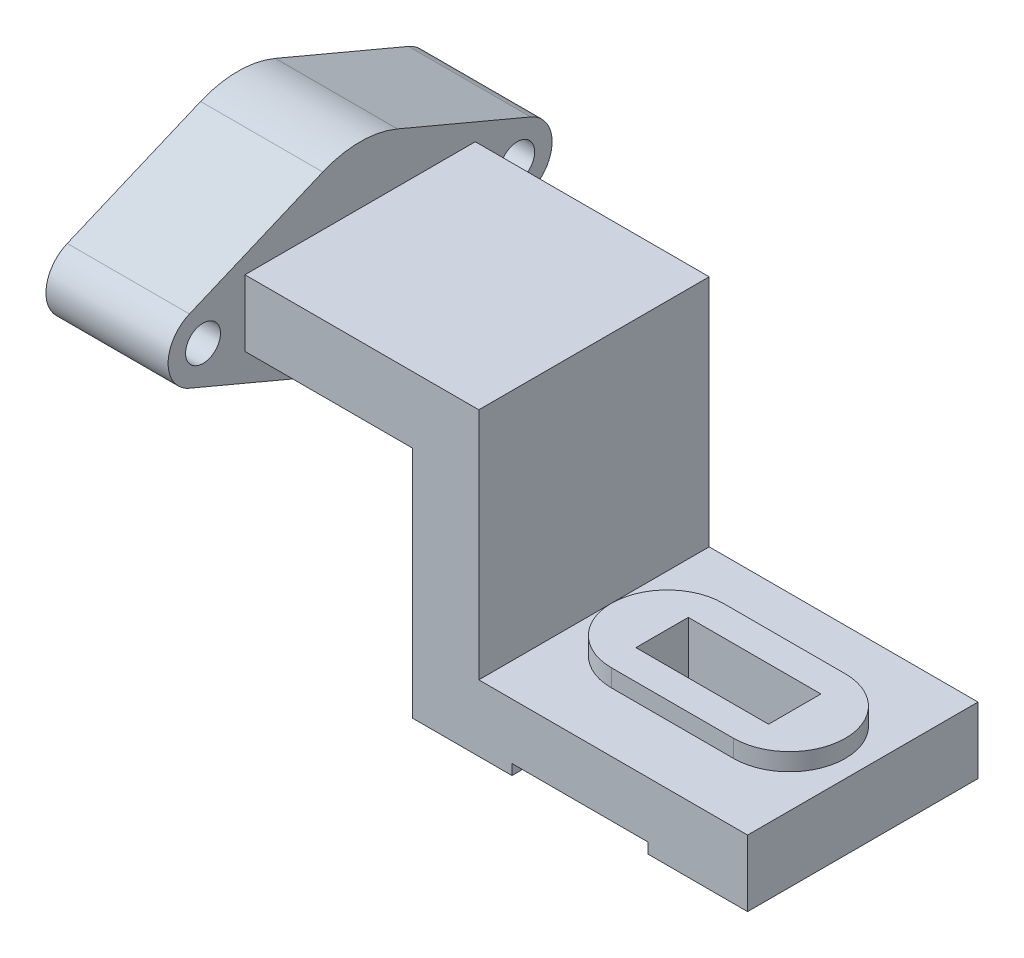
ISO-10303-21;
HEADER;
FILE_DESCRIPTION(('STEP AP214'),'2;1');
FILE_NAME('part.step','',(''),(''),'','','');
FILE_SCHEMA(('AUTOMOTIVE_DESIGN { 1 0 10303 214 1 1 1 1 }'));
ENDSEC;
DATA;
#1=APPLICATION_CONTEXT('core data for automotive mechanical design processes');
#2=APPLICATION_PROTOCOL_DEFINITION('international standard','automotive_design',2000,#1);
#3=PRODUCT_CONTEXT('',#1,'mechanical');
#4=PRODUCT('Part','Part','',(#3));
#5=PRODUCT_RELATED_PRODUCT_CATEGORY('part','',(#4));
#6=PRODUCT_DEFINITION_FORMATION('','',#4);
#7=PRODUCT_DEFINITION_CONTEXT('part definition',#1,'design');
#8=PRODUCT_DEFINITION('design','',#6,#7);
#9=PRODUCT_DEFINITION_SHAPE('','',#8);
#10=(LENGTH_UNIT() NAMED_UNIT(*) SI_UNIT(.MILLI.,.METRE.));
#11=(NAMED_UNIT(*) PLANE_ANGLE_UNIT() SI_UNIT($,.RADIAN.));
#12=(NAMED_UNIT(*) SI_UNIT($,.STERADIAN.) SOLID_ANGLE_UNIT());
#13=UNCERTAINTY_MEASURE_WITH_UNIT(LENGTH_MEASURE(1.E-05),#10,'distance_accuracy_value','');
#14=(GEOMETRIC_REPRESENTATION_CONTEXT(3) GLOBAL_UNCERTAINTY_ASSIGNED_CONTEXT((#13)) GLOBAL_UNIT_ASSIGNED_CONTEXT((#10,
#11,#12)) REPRESENTATION_CONTEXT('',''));
#15=CARTESIAN_POINT('',(0.,0.,0.));
#16=DIRECTION('',(0.,0.,1.));
#17=DIRECTION('',(1.,0.,0.));
#18=AXIS2_PLACEMENT_3D('',#15,#16,#17);
#19=CARTESIAN_POINT('',(19.5,3.00000000000001,33.));
#20=DIRECTION('',(1.,0.,0.));
#21=DIRECTION('',(0.,1.,0.));
#22=AXIS2_PLACEMENT_3D('',#19,#20,#21);
#23=PLANE('',#22);
#24=DIRECTION('',(0.,0.,-1.));
#25=VECTOR('',#24,1.);
#26=CARTESIAN_POINT('',(19.5,3.00000000000001,33.));
#27=LINE('',#26,#25);
#28=CARTESIAN_POINT('',(19.5,3.00000000000001,33.));
#29=VERTEX_POINT('',#28);
#30=CARTESIAN_POINT('',(19.5,3.00000000000001,7.50000000000001));
#31=VERTEX_POINT('',#30);
#32=EDGE_CURVE('E482',#29,#31,#27,.T.);
#33=ORIENTED_EDGE('',*,*,#32,.T.);
#34=DIRECTION('',(0.,-1.,0.));
#35=VECTOR('',#34,1.);
#36=CARTESIAN_POINT('',(19.5,3.00000000000001,7.50000000000001));
#37=LINE('',#36,#35);
#38=CARTESIAN_POINT('',(19.5,0.,7.50000000000001));
#39=VERTEX_POINT('',#38);
#40=EDGE_CURVE('E326',#31,#39,#37,.T.);
#41=ORIENTED_EDGE('',*,*,#40,.T.);
#42=DIRECTION('',(0.,0.,-1.));
#43=VECTOR('',#42,1.);
#44=CARTESIAN_POINT('',(19.5,0.,33.));
#45=LINE('',#44,#43);
#46=CARTESIAN_POINT('',(19.5,0.,33.));
#47=VERTEX_POINT('',#46);
#48=EDGE_CURVE('E477',#47,#39,#45,.T.);
#49=ORIENTED_EDGE('',*,*,#48,.F.);
#50=DIRECTION('',(0.,-1.,0.));
#51=VECTOR('',#50,1.);
#52=CARTESIAN_POINT('',(19.5,3.00000000000001,33.));
#53=LINE('',#52,#51);
#54=EDGE_CURVE('E400',#29,#47,#53,.T.);
#55=ORIENTED_EDGE('',*,*,#54,.F.);
#56=EDGE_LOOP('',(#33,#41,#49,#55));
#57=FACE_BOUND('',#56,.T.);
#58=ADVANCED_FACE('F45',(#57),#23,.F.);
#59=CARTESIAN_POINT('',(-29.,19.,33.));
#60=DIRECTION('',(0.,-1.,0.));
#61=DIRECTION('',(0.,0.,-1.));
#62=AXIS2_PLACEMENT_3D('',#59,#60,#61);
#63=PLANE('',#62);
#64=DIRECTION('',(-1.,0.,0.));
#65=VECTOR('',#64,1.);
#66=CARTESIAN_POINT('',(-29.,19.,-33.));
#67=LINE('',#66,#65);
#68=CARTESIAN_POINT('',(48.,19.,-33.));
#69=VERTEX_POINT('',#68);
#70=CARTESIAN_POINT('',(-29.,19.,-33.));
#71=VERTEX_POINT('',#70);
#72=EDGE_CURVE('E448',#69,#71,#67,.T.);
#73=ORIENTED_EDGE('',*,*,#72,.T.);
#74=DIRECTION('',(0.,0.,-1.));
#75=VECTOR('',#74,1.);
#76=CARTESIAN_POINT('',(-29.,19.,33.));
#77=LINE('',#76,#75);
#78=CARTESIAN_POINT('',(-29.,19.,33.));
#79=VERTEX_POINT('',#78);
#80=EDGE_CURVE('E464',#79,#71,#77,.T.);
#81=ORIENTED_EDGE('',*,*,#80,.F.);
#82=DIRECTION('',(-1.,0.,0.));
#83=VECTOR('',#82,1.);
#84=CARTESIAN_POINT('',(-29.,19.,33.));
#85=LINE('',#84,#83);
#86=CARTESIAN_POINT('',(48.,19.,33.));
#87=VERTEX_POINT('',#86);
#88=EDGE_CURVE('E409',#87,#79,#85,.T.);
#89=ORIENTED_EDGE('',*,*,#88,.F.);
#90=DIRECTION('',(0.,0.,-1.));
#91=VECTOR('',#90,1.);
#92=CARTESIAN_POINT('',(48.,19.,33.));
#93=LINE('',#92,#91);
#94=EDGE_CURVE('E468',#87,#69,#93,.T.);
#95=ORIENTED_EDGE('',*,*,#94,.T.);
#96=EDGE_LOOP('',(#73,#81,#89,#95));
#97=FACE_BOUND('',#96,.T.);
#98=CARTESIAN_POINT('',(-7.99999999999999,19.,0.));
#99=DIRECTION('',(0.,1.,0.));
#100=DIRECTION('',(0.,0.,1.));
#101=AXIS2_PLACEMENT_3D('',#98,#99,#100);
#102=CIRCLE('',#101,16.);
#103=CARTESIAN_POINT('',(-8.00000000000001,19.,-16.));
#104=VERTEX_POINT('',#103);
#105=CARTESIAN_POINT('',(-8.,19.,16.));
#106=VERTEX_POINT('',#105);
#107=EDGE_CURVE('E334',#104,#106,#102,.T.);
#108=ORIENTED_EDGE('',*,*,#107,.F.);
#109=DIRECTION('',(-1.,0.,0.));
#110=VECTOR('',#109,1.);
#111=CARTESIAN_POINT('',(-8.00000000000001,19.,-16.));
#112=LINE('',#111,#110);
#113=CARTESIAN_POINT('',(27.,19.,-16.));
#114=VERTEX_POINT('',#113);
#115=EDGE_CURVE('E340',#114,#104,#112,.T.);
#116=ORIENTED_EDGE('',*,*,#115,.F.);
#117=CARTESIAN_POINT('',(27.,19.,0.));
#118=DIRECTION('',(0.,1.,0.));
#119=DIRECTION('',(0.,0.,1.));
#120=AXIS2_PLACEMENT_3D('',#117,#118,#119);
#121=CIRCLE('',#120,16.);
#122=CARTESIAN_POINT('',(27.,19.,16.));
#123=VERTEX_POINT('',#122);
#124=EDGE_CURVE('E357',#123,#114,#121,.T.);
#125=ORIENTED_EDGE('',*,*,#124,.F.);
#126=DIRECTION('',(1.,0.,0.));
#127=VECTOR('',#126,1.);
#128=CARTESIAN_POINT('',(-8.,19.,16.));
#129=LINE('',#128,#127);
#130=EDGE_CURVE('E353',#106,#123,#129,.T.);
#131=ORIENTED_EDGE('',*,*,#130,.F.);
#132=EDGE_LOOP('',(#108,#116,#125,#131));
#133=FACE_BOUND('',#132,.T.);
#134=ADVANCED_FACE('F542',(#97,#133),#63,.F.);
#135=CARTESIAN_POINT('',(-48.,67.,33.));
#136=DIRECTION('',(0.,1.,0.));
#137=DIRECTION('',(0.,0.,1.));
#138=AXIS2_PLACEMENT_3D('',#135,#136,#137);
#139=PLANE('',#138);
#140=DIRECTION('',(1.,0.,0.));
#141=VECTOR('',#140,1.);
#142=CARTESIAN_POINT('',(-48.,67.,-33.));
#143=LINE('',#142,#141);
#144=CARTESIAN_POINT('',(-96.,67.,-33.));
#145=VERTEX_POINT('',#144);
#146=CARTESIAN_POINT('',(-48.,67.,-33.));
#147=VERTEX_POINT('',#146);
#148=EDGE_CURVE('E422',#145,#147,#143,.T.);
#149=ORIENTED_EDGE('',*,*,#148,.T.);
#150=DIRECTION('',(0.,0.,-1.));
#151=VECTOR('',#150,1.);
#152=CARTESIAN_POINT('',(-48.,67.,33.));
#153=LINE('',#152,#151);
#154=CARTESIAN_POINT('',(-48.,67.,33.));
#155=VERTEX_POINT('',#154);
#156=EDGE_CURVE('E54',#155,#147,#153,.T.);
#157=ORIENTED_EDGE('',*,*,#156,.F.);
#158=DIRECTION('',(1.,0.,0.));
#159=VECTOR('',#158,1.);
#160=CARTESIAN_POINT('',(-48.,67.,33.));
#161=LINE('',#160,#159);
#162=CARTESIAN_POINT('',(-96.,67.,33.));
#163=VERTEX_POINT('',#162);
#164=EDGE_CURVE('E384',#163,#155,#161,.T.);
#165=ORIENTED_EDGE('',*,*,#164,.F.);
#166=DIRECTION('',(0.,0.,-1.));
#167=VECTOR('',#166,1.);
#168=CARTESIAN_POINT('',(-96.,67.,33.));
#169=LINE('',#168,#167);
#170=EDGE_CURVE('E11',#163,#145,#169,.T.);
#171=ORIENTED_EDGE('',*,*,#170,.T.);
#172=EDGE_LOOP('',(#149,#157,#165,#171));
#173=FACE_BOUND('',#172,.T.);
#174=ADVANCED_FACE('F47',(#173),#139,.F.);
#175=CARTESIAN_POINT('',(-48.,0.,33.));
#176=DIRECTION('',(1.,0.,0.));
#177=DIRECTION('',(0.,0.,-1.));
#178=AXIS2_PLACEMENT_3D('',#175,#176,#177);
#179=PLANE('',#178);
#180=DIRECTION('',(0.,-1.,0.));
#181=VECTOR('',#180,1.);
#182=CARTESIAN_POINT('',(-48.,0.,-33.));
#183=LINE('',#182,#181);
#184=CARTESIAN_POINT('',(-48.,0.,-33.));
#185=VERTEX_POINT('',#184);
#186=EDGE_CURVE('E425',#147,#185,#183,.T.);
#187=ORIENTED_EDGE('',*,*,#186,.T.);
#188=DIRECTION('',(0.,0.,-1.));
#189=VECTOR('',#188,1.);
#190=CARTESIAN_POINT('',(-48.,0.,33.));
#191=LINE('',#190,#189);
#192=CARTESIAN_POINT('',(-48.,0.,33.));
#193=VERTEX_POINT('',#192);
#194=EDGE_CURVE('E494',#193,#185,#191,.T.);
#195=ORIENTED_EDGE('',*,*,#194,.F.);
#196=DIRECTION('',(0.,-1.,0.));
#197=VECTOR('',#196,1.);
#198=CARTESIAN_POINT('',(-48.,0.,33.));
#199=LINE('',#198,#197);
#200=EDGE_CURVE('E388',#155,#193,#199,.T.);
#201=ORIENTED_EDGE('',*,*,#200,.F.);
#202=ORIENTED_EDGE('',*,*,#156,.T.);
#203=EDGE_LOOP('',(#187,#195,#201,#202));
#204=FACE_BOUND('',#203,.T.);
#205=ADVANCED_FACE('F503',(#204),#179,.F.);
#206=CARTESIAN_POINT('',(-19.5,0.,33.));
#207=DIRECTION('',(0.,1.,0.));
#208=DIRECTION('',(-1.,0.,0.));
#209=AXIS2_PLACEMENT_3D('',#206,#207,#208);
#210=PLANE('',#209);
#211=DIRECTION('',(1.,0.,0.));
#212=VECTOR('',#211,1.);
#213=CARTESIAN_POINT('',(-19.5,0.,-33.));
#214=LINE('',#213,#212);
#215=CARTESIAN_POINT('',(-19.5,0.,-33.));
#216=VERTEX_POINT('',#215);
#217=EDGE_CURVE('E428',#185,#216,#214,.T.);
#218=ORIENTED_EDGE('',*,*,#217,.T.);
#219=DIRECTION('',(0.,0.,-1.));
#220=VECTOR('',#219,1.);
#221=CARTESIAN_POINT('',(-19.5,0.,33.));
#222=LINE('',#221,#220);
#223=CARTESIAN_POINT('',(-19.5,0.,33.));
#224=VERTEX_POINT('',#223);
#225=EDGE_CURVE('E490',#224,#216,#222,.T.);
#226=ORIENTED_EDGE('',*,*,#225,.F.);
#227=DIRECTION('',(1.,0.,0.));
#228=VECTOR('',#227,1.);
#229=CARTESIAN_POINT('',(-19.5,0.,33.));
#230=LINE('',#229,#228);
#231=EDGE_CURVE('E391',#193,#224,#230,.T.);
#232=ORIENTED_EDGE('',*,*,#231,.F.);
#233=ORIENTED_EDGE('',*,*,#194,.T.);
#234=EDGE_LOOP('',(#218,#226,#232,#233));
#235=FACE_BOUND('',#234,.T.);
#236=ADVANCED_FACE('F513',(#235),#210,.F.);
#237=CARTESIAN_POINT('',(-19.5,0.,33.));
#238=DIRECTION('',(-1.,0.,0.));
#239=DIRECTION('',(0.,-1.,0.));
#240=AXIS2_PLACEMENT_3D('',#237,#238,#239);
#241=PLANE('',#240);
#242=DIRECTION('',(0.,1.,0.));
#243=VECTOR('',#242,1.);
#244=CARTESIAN_POINT('',(-19.5,0.,-33.));
#245=LINE('',#244,#243);
#246=CARTESIAN_POINT('',(-19.5,3.,-33.));
#247=VERTEX_POINT('',#246);
#248=EDGE_CURVE('E431',#216,#247,#245,.T.);
#249=ORIENTED_EDGE('',*,*,#248,.T.);
#250=DIRECTION('',(0.,0.,-1.));
#251=VECTOR('',#250,1.);
#252=CARTESIAN_POINT('',(-19.5,3.,33.));
#253=LINE('',#252,#251);
#254=CARTESIAN_POINT('',(-19.5,3.,33.));
#255=VERTEX_POINT('',#254);
#256=EDGE_CURVE('E486',#255,#247,#253,.T.);
#257=ORIENTED_EDGE('',*,*,#256,.F.);
#258=DIRECTION('',(0.,1.,0.));
#259=VECTOR('',#258,1.);
#260=CARTESIAN_POINT('',(-19.5,0.,33.));
#261=LINE('',#260,#259);
#262=EDGE_CURVE('E394',#224,#255,#261,.T.);
#263=ORIENTED_EDGE('',*,*,#262,.F.);
#264=ORIENTED_EDGE('',*,*,#225,.T.);
#265=EDGE_LOOP('',(#249,#257,#263,#264));
#266=FACE_BOUND('',#265,.T.);
#267=ADVANCED_FACE('F517',(#266),#241,.F.);
#268=CARTESIAN_POINT('',(-19.5,3.,33.));
#269=DIRECTION('',(0.,1.,0.));
#270=DIRECTION('',(-1.,0.,0.));
#271=AXIS2_PLACEMENT_3D('',#268,#269,#270);
#272=PLANE('',#271);
#273=DIRECTION('',(0.,0.,1.));
#274=VECTOR('',#273,1.);
#275=CARTESIAN_POINT('',(-9.49999999999999,3.,33.));
#276=LINE('',#275,#274);
#277=CARTESIAN_POINT('',(-9.5,3.,-7.49999999999999));
#278=VERTEX_POINT('',#277);
#279=CARTESIAN_POINT('',(-9.49999999999999,3.,7.50000000000001));
#280=VERTEX_POINT('',#279);
#281=EDGE_CURVE('E322',#278,#280,#276,.T.);
#282=ORIENTED_EDGE('',*,*,#281,.T.);
#283=DIRECTION('',(1.,0.,0.));
#284=VECTOR('',#283,1.);
#285=CARTESIAN_POINT('',(-19.5,3.,7.50000000000001));
#286=LINE('',#285,#284);
#287=EDGE_CURVE('E330',#280,#31,#286,.T.);
#288=ORIENTED_EDGE('',*,*,#287,.T.);
#289=ORIENTED_EDGE('',*,*,#32,.F.);
#290=DIRECTION('',(1.,0.,0.));
#291=VECTOR('',#290,1.);
#292=CARTESIAN_POINT('',(-19.5,3.,33.));
#293=LINE('',#292,#291);
#294=EDGE_CURVE('E397',#255,#29,#293,.T.);
#295=ORIENTED_EDGE('',*,*,#294,.F.);
#296=ORIENTED_EDGE('',*,*,#256,.T.);
#297=DIRECTION('',(1.,0.,0.));
#298=VECTOR('',#297,1.);
#299=CARTESIAN_POINT('',(-19.5,3.,-33.));
#300=LINE('',#299,#298);
#301=CARTESIAN_POINT('',(19.5,3.00000000000001,-33.));
#302=VERTEX_POINT('',#301);
#303=EDGE_CURVE('E434',#247,#302,#300,.T.);
#304=ORIENTED_EDGE('',*,*,#303,.T.);
#305=CARTESIAN_POINT('',(19.5,3.00000000000001,-7.49999999999999));
#306=VERTEX_POINT('',#305);
#307=EDGE_CURVE('E481',#306,#302,#27,.T.);
#308=ORIENTED_EDGE('',*,*,#307,.F.);
#309=DIRECTION('',(-1.,0.,0.));
#310=VECTOR('',#309,1.);
#311=CARTESIAN_POINT('',(-19.5,3.,-7.49999999999999));
#312=LINE('',#311,#310);
#313=EDGE_CURVE('E318',#306,#278,#312,.T.);
#314=ORIENTED_EDGE('',*,*,#313,.T.);
#315=EDGE_LOOP('',(#282,#288,#289,#295,#296,#304,#308,#314));
#316=FACE_BOUND('',#315,.T.);
#317=ADVANCED_FACE('F560',(#316),#272,.F.);
#318=CARTESIAN_POINT('',(19.5,0.,-7.49999999999999));
#319=VERTEX_POINT('',#318);
#320=CARTESIAN_POINT('',(19.5,0.,-33.));
#321=VERTEX_POINT('',#320);
#322=EDGE_CURVE('E476',#319,#321,#45,.T.);
#323=ORIENTED_EDGE('',*,*,#322,.F.);
#324=DIRECTION('',(0.,1.,0.));
#325=VECTOR('',#324,1.);
#326=CARTESIAN_POINT('',(19.5,3.00000000000001,-7.49999999999999));
#327=LINE('',#326,#325);
#328=EDGE_CURVE('E61',#319,#306,#327,.T.);
#329=ORIENTED_EDGE('',*,*,#328,.T.);
#330=ORIENTED_EDGE('',*,*,#307,.T.);
#331=DIRECTION('',(0.,-1.,0.));
#332=VECTOR('',#331,1.);
#333=CARTESIAN_POINT('',(19.5,3.00000000000001,-33.));
#334=LINE('',#333,#332);
#335=EDGE_CURVE('E438',#302,#321,#334,.T.);
#336=ORIENTED_EDGE('',*,*,#335,.T.);
#337=EDGE_LOOP('',(#323,#329,#330,#336));
#338=FACE_BOUND('',#337,.T.);
#339=ADVANCED_FACE('F556',(#338),#23,.F.);
#340=CARTESIAN_POINT('',(48.,0.,33.));
#341=DIRECTION('',(0.,1.,0.));
#342=DIRECTION('',(-1.,0.,0.));
#343=AXIS2_PLACEMENT_3D('',#340,#341,#342);
#344=PLANE('',#343);
#345=ORIENTED_EDGE('',*,*,#48,.T.);
#346=DIRECTION('',(1.,0.,0.));
#347=VECTOR('',#346,1.);
#348=CARTESIAN_POINT('',(-9.49999999999999,0.,7.50000000000001));
#349=LINE('',#348,#347);
#350=CARTESIAN_POINT('',(28.5,0.,7.50000000000001));
#351=VERTEX_POINT('',#350);
#352=EDGE_CURVE('E290',#39,#351,#349,.T.);
#353=ORIENTED_EDGE('',*,*,#352,.T.);
#354=DIRECTION('',(0.,0.,-1.));
#355=VECTOR('',#354,1.);
#356=CARTESIAN_POINT('',(28.5,0.,-7.49999999999999));
#357=LINE('',#356,#355);
#358=CARTESIAN_POINT('',(28.5,0.,-7.49999999999999));
#359=VERTEX_POINT('',#358);
#360=EDGE_CURVE('E282',#351,#359,#357,.T.);
#361=ORIENTED_EDGE('',*,*,#360,.T.);
#362=DIRECTION('',(-1.,0.,0.));
#363=VECTOR('',#362,1.);
#364=CARTESIAN_POINT('',(-9.5,0.,-7.49999999999999));
#365=LINE('',#364,#363);
#366=EDGE_CURVE('E286',#359,#319,#365,.T.);
#367=ORIENTED_EDGE('',*,*,#366,.T.);
#368=ORIENTED_EDGE('',*,*,#322,.T.);
#369=DIRECTION('',(1.,0.,0.));
#370=VECTOR('',#369,1.);
#371=CARTESIAN_POINT('',(48.,0.,-33.));
#372=LINE('',#371,#370);
#373=CARTESIAN_POINT('',(48.,0.,-33.));
#374=VERTEX_POINT('',#373);
#375=EDGE_CURVE('E442',#321,#374,#372,.T.);
#376=ORIENTED_EDGE('',*,*,#375,.T.);
#377=DIRECTION('',(0.,0.,-1.));
#378=VECTOR('',#377,1.);
#379=CARTESIAN_POINT('',(48.,0.,33.));
#380=LINE('',#379,#378);
#381=CARTESIAN_POINT('',(48.,0.,33.));
#382=VERTEX_POINT('',#381);
#383=EDGE_CURVE('E472',#382,#374,#380,.T.);
#384=ORIENTED_EDGE('',*,*,#383,.F.);
#385=DIRECTION('',(1.,0.,0.));
#386=VECTOR('',#385,1.);
#387=CARTESIAN_POINT('',(48.,0.,33.));
#388=LINE('',#387,#386);
#389=EDGE_CURVE('E403',#47,#382,#388,.T.);
#390=ORIENTED_EDGE('',*,*,#389,.F.);
#391=EDGE_LOOP('',(#345,#353,#361,#367,#368,#376,#384,#390));
#392=FACE_BOUND('',#391,.T.);
#393=ADVANCED_FACE('F552',(#392),#344,.F.);
#394=CARTESIAN_POINT('',(48.,19.,33.));
#395=DIRECTION('',(-1.,0.,0.));
#396=DIRECTION('',(0.,0.,1.));
#397=AXIS2_PLACEMENT_3D('',#394,#395,#396);
#398=PLANE('',#397);
#399=DIRECTION('',(0.,1.,0.));
#400=VECTOR('',#399,1.);
#401=CARTESIAN_POINT('',(48.,19.,-33.));
#402=LINE('',#401,#400);
#403=EDGE_CURVE('E445',#374,#69,#402,.T.);
#404=ORIENTED_EDGE('',*,*,#403,.T.);
#405=ORIENTED_EDGE('',*,*,#94,.F.);
#406=DIRECTION('',(0.,1.,0.));
#407=VECTOR('',#406,1.);
#408=CARTESIAN_POINT('',(48.,19.,33.));
#409=LINE('',#408,#407);
#410=EDGE_CURVE('E406',#382,#87,#409,.T.);
#411=ORIENTED_EDGE('',*,*,#410,.F.);
#412=ORIENTED_EDGE('',*,*,#383,.T.);
#413=EDGE_LOOP('',(#404,#405,#411,#412));
#414=FACE_BOUND('',#413,.T.);
#415=ADVANCED_FACE('F548',(#414),#398,.F.);
#416=CARTESIAN_POINT('',(-29.,86.,33.));
#417=DIRECTION('',(-1.,0.,0.));
#418=DIRECTION('',(0.,-1.,0.));
#419=AXIS2_PLACEMENT_3D('',#416,#417,#418);
#420=PLANE('',#419);
#421=DIRECTION('',(0.,1.,0.));
#422=VECTOR('',#421,1.);
#423=CARTESIAN_POINT('',(-29.,86.,-33.));
#424=LINE('',#423,#422);
#425=CARTESIAN_POINT('',(-29.,86.,-33.));
#426=VERTEX_POINT('',#425);
#427=EDGE_CURVE('E451',#71,#426,#424,.T.);
#428=ORIENTED_EDGE('',*,*,#427,.T.);
#429=DIRECTION('',(0.,0.,-1.));
#430=VECTOR('',#429,1.);
#431=CARTESIAN_POINT('',(-29.,86.,33.));
#432=LINE('',#431,#430);
#433=CARTESIAN_POINT('',(-29.,86.,33.));
#434=VERTEX_POINT('',#433);
#435=EDGE_CURVE('E460',#434,#426,#432,.T.);
#436=ORIENTED_EDGE('',*,*,#435,.F.);
#437=DIRECTION('',(0.,1.,0.));
#438=VECTOR('',#437,1.);
#439=CARTESIAN_POINT('',(-29.,86.,33.));
#440=LINE('',#439,#438);
#441=EDGE_CURVE('E412',#79,#434,#440,.T.);
#442=ORIENTED_EDGE('',*,*,#441,.F.);
#443=ORIENTED_EDGE('',*,*,#80,.T.);
#444=EDGE_LOOP('',(#428,#436,#442,#443));
#445=FACE_BOUND('',#444,.T.);
#446=ADVANCED_FACE('F536',(#445),#420,.F.);
#447=CARTESIAN_POINT('',(-96.,86.,33.));
#448=DIRECTION('',(0.,-1.,0.));
#449=DIRECTION('',(0.,0.,-1.));
#450=AXIS2_PLACEMENT_3D('',#447,#448,#449);
#451=PLANE('',#450);
#452=DIRECTION('',(-1.,0.,0.));
#453=VECTOR('',#452,1.);
#454=CARTESIAN_POINT('',(-96.,86.,-33.));
#455=LINE('',#454,#453);
#456=CARTESIAN_POINT('',(-96.,86.,-33.));
#457=VERTEX_POINT('',#456);
#458=EDGE_CURVE('E385',#426,#457,#455,.T.);
#459=ORIENTED_EDGE('',*,*,#458,.T.);
#460=DIRECTION('',(0.,0.,-1.));
#461=VECTOR('',#460,1.);
#462=CARTESIAN_POINT('',(-96.,86.,33.));
#463=LINE('',#462,#461);
#464=CARTESIAN_POINT('',(-96.,86.,33.));
#465=VERTEX_POINT('',#464);
#466=EDGE_CURVE('E418',#465,#457,#463,.T.);
#467=ORIENTED_EDGE('',*,*,#466,.F.);
#468=DIRECTION('',(-1.,0.,0.));
#469=VECTOR('',#468,1.);
#470=CARTESIAN_POINT('',(-96.,86.,33.));
#471=LINE('',#470,#469);
#472=EDGE_CURVE('E415',#434,#465,#471,.T.);
#473=ORIENTED_EDGE('',*,*,#472,.F.);
#474=ORIENTED_EDGE('',*,*,#435,.T.);
#475=EDGE_LOOP('',(#459,#467,#473,#474));
#476=FACE_BOUND('',#475,.T.);
#477=ADVANCED_FACE('F531',(#476),#451,.F.);
#478=CARTESIAN_POINT('',(0.,0.,33.));
#479=DIRECTION('',(0.,0.,-1.));
#480=DIRECTION('',(-1.,0.,0.));
#481=AXIS2_PLACEMENT_3D('',#478,#479,#480);
#482=PLANE('',#481);
#483=DIRECTION('',(0.,-1.,0.));
#484=VECTOR('',#483,1.);
#485=CARTESIAN_POINT('',(-96.,67.,33.));
#486=LINE('',#485,#484);
#487=EDGE_CURVE('E380',#465,#163,#486,.T.);
#488=ORIENTED_EDGE('',*,*,#487,.T.);
#489=ORIENTED_EDGE('',*,*,#164,.T.);
#490=ORIENTED_EDGE('',*,*,#200,.T.);
#491=ORIENTED_EDGE('',*,*,#231,.T.);
#492=ORIENTED_EDGE('',*,*,#262,.T.);
#493=ORIENTED_EDGE('',*,*,#294,.T.);
#494=ORIENTED_EDGE('',*,*,#54,.T.);
#495=ORIENTED_EDGE('',*,*,#389,.T.);
#496=ORIENTED_EDGE('',*,*,#410,.T.);
#497=ORIENTED_EDGE('',*,*,#88,.T.);
#498=ORIENTED_EDGE('',*,*,#441,.T.);
#499=ORIENTED_EDGE('',*,*,#472,.T.);
#500=EDGE_LOOP('',(#488,#489,#490,#491,#492,#493,#494,#495,#496,#497,#498,#499));
#501=FACE_BOUND('',#500,.T.);
#502=ADVANCED_FACE('F521',(#501),#482,.F.);
#503=CARTESIAN_POINT('',(0.,0.,-33.));
#504=DIRECTION('',(0.,0.,-1.));
#505=DIRECTION('',(-1.,0.,0.));
#506=AXIS2_PLACEMENT_3D('',#503,#504,#505);
#507=PLANE('',#506);
#508=DIRECTION('',(0.,-1.,0.));
#509=VECTOR('',#508,1.);
#510=CARTESIAN_POINT('',(-96.,67.,-33.));
#511=LINE('',#510,#509);
#512=EDGE_CURVE('E379',#457,#145,#511,.T.);
#513=ORIENTED_EDGE('',*,*,#512,.F.);
#514=ORIENTED_EDGE('',*,*,#458,.F.);
#515=ORIENTED_EDGE('',*,*,#427,.F.);
#516=ORIENTED_EDGE('',*,*,#72,.F.);
#517=ORIENTED_EDGE('',*,*,#403,.F.);
#518=ORIENTED_EDGE('',*,*,#375,.F.);
#519=ORIENTED_EDGE('',*,*,#335,.F.);
#520=ORIENTED_EDGE('',*,*,#303,.F.);
#521=ORIENTED_EDGE('',*,*,#248,.F.);
#522=ORIENTED_EDGE('',*,*,#217,.F.);
#523=ORIENTED_EDGE('',*,*,#186,.F.);
#524=ORIENTED_EDGE('',*,*,#148,.F.);
#525=EDGE_LOOP('',(#513,#514,#515,#516,#517,#518,#519,#520,#521,#522,#523,#524));
#526=FACE_BOUND('',#525,.T.);
#527=ADVANCED_FACE('F508',(#526),#507,.T.);
#528=CARTESIAN_POINT('',(-7.99999999999999,24.,0.));
#529=DIRECTION('',(0.,-1.,0.));
#530=DIRECTION('',(0.,0.,-1.));
#531=AXIS2_PLACEMENT_3D('',#528,#529,#530);
#532=CYLINDRICAL_SURFACE('',#531,16.);
#533=ORIENTED_EDGE('',*,*,#107,.T.);
#534=DIRECTION('',(0.,-1.,0.));
#535=VECTOR('',#534,1.);
#536=CARTESIAN_POINT('',(-8.,24.,16.));
#537=LINE('',#536,#535);
#538=CARTESIAN_POINT('',(-8.,24.,16.));
#539=VERTEX_POINT('',#538);
#540=EDGE_CURVE('E375',#539,#106,#537,.T.);
#541=ORIENTED_EDGE('',*,*,#540,.F.);
#542=CARTESIAN_POINT('',(-7.99999999999999,24.,0.));
#543=DIRECTION('',(0.,1.,0.));
#544=DIRECTION('',(0.,0.,1.));
#545=AXIS2_PLACEMENT_3D('',#542,#543,#544);
#546=CIRCLE('',#545,16.);
#547=CARTESIAN_POINT('',(-8.00000000000001,24.,-16.));
#548=VERTEX_POINT('',#547);
#549=EDGE_CURVE('E335',#548,#539,#546,.T.);
#550=ORIENTED_EDGE('',*,*,#549,.F.);
#551=DIRECTION('',(0.,-1.,0.));
#552=VECTOR('',#551,1.);
#553=CARTESIAN_POINT('',(-8.00000000000001,24.,-16.));
#554=LINE('',#553,#552);
#555=EDGE_CURVE('E349',#548,#104,#554,.T.);
#556=ORIENTED_EDGE('',*,*,#555,.T.);
#557=EDGE_LOOP('',(#533,#541,#550,#556));
#558=FACE_BOUND('',#557,.T.);
#559=ADVANCED_FACE('F631',(#558),#532,.T.);
#560=CARTESIAN_POINT('',(-8.,24.,16.));
#561=DIRECTION('',(0.,0.,-1.));
#562=DIRECTION('',(-1.,0.,0.));
#563=AXIS2_PLACEMENT_3D('',#560,#561,#562);
#564=PLANE('',#563);
#565=ORIENTED_EDGE('',*,*,#130,.T.);
#566=DIRECTION('',(0.,-1.,0.));
#567=VECTOR('',#566,1.);
#568=CARTESIAN_POINT('',(27.,24.,16.));
#569=LINE('',#568,#567);
#570=CARTESIAN_POINT('',(27.,24.,16.));
#571=VERTEX_POINT('',#570);
#572=EDGE_CURVE('E371',#571,#123,#569,.T.);
#573=ORIENTED_EDGE('',*,*,#572,.F.);
#574=DIRECTION('',(1.,0.,0.));
#575=VECTOR('',#574,1.);
#576=CARTESIAN_POINT('',(-8.,24.,16.));
#577=LINE('',#576,#575);
#578=EDGE_CURVE('E339',#539,#571,#577,.T.);
#579=ORIENTED_EDGE('',*,*,#578,.F.);
#580=ORIENTED_EDGE('',*,*,#540,.T.);
#581=EDGE_LOOP('',(#565,#573,#579,#580));
#582=FACE_BOUND('',#581,.T.);
#583=ADVANCED_FACE('F817',(#582),#564,.F.);
#584=CARTESIAN_POINT('',(27.,24.,0.));
#585=DIRECTION('',(0.,-1.,0.));
#586=DIRECTION('',(0.,0.,-1.));
#587=AXIS2_PLACEMENT_3D('',#584,#585,#586);
#588=CYLINDRICAL_SURFACE('',#587,16.);
#589=ORIENTED_EDGE('',*,*,#124,.T.);
#590=DIRECTION('',(0.,-1.,0.));
#591=VECTOR('',#590,1.);
#592=CARTESIAN_POINT('',(27.,24.,-16.));
#593=LINE('',#592,#591);
#594=CARTESIAN_POINT('',(27.,24.,-16.));
#595=VERTEX_POINT('',#594);
#596=EDGE_CURVE('E367',#595,#114,#593,.T.);
#597=ORIENTED_EDGE('',*,*,#596,.F.);
#598=CARTESIAN_POINT('',(27.,24.,0.));
#599=DIRECTION('',(0.,1.,0.));
#600=DIRECTION('',(0.,0.,1.));
#601=AXIS2_PLACEMENT_3D('',#598,#599,#600);
#602=CIRCLE('',#601,16.);
#603=EDGE_CURVE('E343',#571,#595,#602,.T.);
#604=ORIENTED_EDGE('',*,*,#603,.F.);
#605=ORIENTED_EDGE('',*,*,#572,.T.);
#606=EDGE_LOOP('',(#589,#597,#604,#605));
#607=FACE_BOUND('',#606,.T.);
#608=ADVANCED_FACE('F808',(#607),#588,.T.);
#609=CARTESIAN_POINT('',(-8.00000000000001,24.,-16.));
#610=DIRECTION('',(0.,0.,1.));
#611=DIRECTION('',(1.,0.,0.));
#612=AXIS2_PLACEMENT_3D('',#609,#610,#611);
#613=PLANE('',#612);
#614=ORIENTED_EDGE('',*,*,#115,.T.);
#615=ORIENTED_EDGE('',*,*,#555,.F.);
#616=DIRECTION('',(-1.,0.,0.));
#617=VECTOR('',#616,1.);
#618=CARTESIAN_POINT('',(-8.00000000000001,24.,-16.));
#619=LINE('',#618,#617);
#620=EDGE_CURVE('E346',#595,#548,#619,.T.);
#621=ORIENTED_EDGE('',*,*,#620,.F.);
#622=ORIENTED_EDGE('',*,*,#596,.T.);
#623=EDGE_LOOP('',(#614,#615,#621,#622));
#624=FACE_BOUND('',#623,.T.);
#625=ADVANCED_FACE('F800',(#624),#613,.F.);
#626=CARTESIAN_POINT('',(-7.99999999999999,24.,0.));
#627=DIRECTION('',(0.,1.,0.));
#628=DIRECTION('',(0.,0.,1.));
#629=AXIS2_PLACEMENT_3D('',#626,#627,#628);
#630=PLANE('',#629);
#631=DIRECTION('',(0.,0.,-1.));
#632=VECTOR('',#631,1.);
#633=CARTESIAN_POINT('',(28.5,24.,-7.49999999999999));
#634=LINE('',#633,#632);
#635=CARTESIAN_POINT('',(28.5,24.,7.50000000000001));
#636=VERTEX_POINT('',#635);
#637=CARTESIAN_POINT('',(28.5,24.,-7.49999999999999));
#638=VERTEX_POINT('',#637);
#639=EDGE_CURVE('E69',#636,#638,#634,.T.);
#640=ORIENTED_EDGE('',*,*,#639,.F.);
#641=DIRECTION('',(1.,0.,0.));
#642=VECTOR('',#641,1.);
#643=CARTESIAN_POINT('',(-9.49999999999999,24.,7.50000000000001));
#644=LINE('',#643,#642);
#645=CARTESIAN_POINT('',(-9.49999999999999,24.,7.50000000000001));
#646=VERTEX_POINT('',#645);
#647=EDGE_CURVE('E287',#646,#636,#644,.T.);
#648=ORIENTED_EDGE('',*,*,#647,.F.);
#649=DIRECTION('',(0.,0.,1.));
#650=VECTOR('',#649,1.);
#651=CARTESIAN_POINT('',(-9.5,24.,-7.49999999999999));
#652=LINE('',#651,#650);
#653=CARTESIAN_POINT('',(-9.5,24.,-7.49999999999999));
#654=VERTEX_POINT('',#653);
#655=EDGE_CURVE('E298',#654,#646,#652,.T.);
#656=ORIENTED_EDGE('',*,*,#655,.F.);
#657=DIRECTION('',(-1.,0.,0.));
#658=VECTOR('',#657,1.);
#659=CARTESIAN_POINT('',(-9.5,24.,-7.49999999999999));
#660=LINE('',#659,#658);
#661=EDGE_CURVE('E276',#638,#654,#660,.T.);
#662=ORIENTED_EDGE('',*,*,#661,.F.);
#663=EDGE_LOOP('',(#640,#648,#656,#662));
#664=FACE_BOUND('',#663,.T.);
#665=ORIENTED_EDGE('',*,*,#549,.T.);
#666=ORIENTED_EDGE('',*,*,#578,.T.);
#667=ORIENTED_EDGE('',*,*,#603,.T.);
#668=ORIENTED_EDGE('',*,*,#620,.T.);
#669=EDGE_LOOP('',(#665,#666,#667,#668));
#670=FACE_BOUND('',#669,.T.);
#671=ADVANCED_FACE('F787',(#664,#670),#630,.T.);
#672=CARTESIAN_POINT('',(-9.49999999999999,0.,7.50000000000001));
#673=DIRECTION('',(0.,0.,1.));
#674=DIRECTION('',(1.,0.,0.));
#675=AXIS2_PLACEMENT_3D('',#672,#673,#674);
#676=PLANE('',#675);
#677=DIRECTION('',(0.,1.,0.));
#678=VECTOR('',#677,1.);
#679=CARTESIAN_POINT('',(-9.49999999999999,0.,7.50000000000001));
#680=LINE('',#679,#678);
#681=EDGE_CURVE('E308',#280,#646,#680,.T.);
#682=ORIENTED_EDGE('',*,*,#681,.T.);
#683=ORIENTED_EDGE('',*,*,#647,.T.);
#684=DIRECTION('',(0.,1.,0.));
#685=VECTOR('',#684,1.);
#686=CARTESIAN_POINT('',(28.5,0.,7.50000000000001));
#687=LINE('',#686,#685);
#688=EDGE_CURVE('E305',#351,#636,#687,.T.);
#689=ORIENTED_EDGE('',*,*,#688,.F.);
#690=ORIENTED_EDGE('',*,*,#352,.F.);
#691=ORIENTED_EDGE('',*,*,#40,.F.);
#692=ORIENTED_EDGE('',*,*,#287,.F.);
#693=EDGE_LOOP('',(#682,#683,#689,#690,#691,#692));
#694=FACE_BOUND('',#693,.T.);
#695=ADVANCED_FACE('F566',(#694),#676,.F.);
#696=CARTESIAN_POINT('',(-9.5,0.,-7.49999999999999));
#697=DIRECTION('',(-1.,0.,0.));
#698=DIRECTION('',(0.,0.,1.));
#699=AXIS2_PLACEMENT_3D('',#696,#697,#698);
#700=PLANE('',#699);
#701=DIRECTION('',(0.,1.,0.));
#702=VECTOR('',#701,1.);
#703=CARTESIAN_POINT('',(-9.5,0.,-7.49999999999999));
#704=LINE('',#703,#702);
#705=EDGE_CURVE('E311',#278,#654,#704,.T.);
#706=ORIENTED_EDGE('',*,*,#705,.T.);
#707=ORIENTED_EDGE('',*,*,#655,.T.);
#708=ORIENTED_EDGE('',*,*,#681,.F.);
#709=ORIENTED_EDGE('',*,*,#281,.F.);
#710=EDGE_LOOP('',(#706,#707,#708,#709));
#711=FACE_BOUND('',#710,.T.);
#712=ADVANCED_FACE('F572',(#711),#700,.F.);
#713=CARTESIAN_POINT('',(-9.5,0.,-7.49999999999999));
#714=DIRECTION('',(0.,0.,-1.));
#715=DIRECTION('',(-1.,0.,0.));
#716=AXIS2_PLACEMENT_3D('',#713,#714,#715);
#717=PLANE('',#716);
#718=ORIENTED_EDGE('',*,*,#328,.F.);
#719=ORIENTED_EDGE('',*,*,#366,.F.);
#720=DIRECTION('',(0.,1.,0.));
#721=VECTOR('',#720,1.);
#722=CARTESIAN_POINT('',(28.5,0.,-7.49999999999999));
#723=LINE('',#722,#721);
#724=EDGE_CURVE('E293',#359,#638,#723,.T.);
#725=ORIENTED_EDGE('',*,*,#724,.T.);
#726=ORIENTED_EDGE('',*,*,#661,.T.);
#727=ORIENTED_EDGE('',*,*,#705,.F.);
#728=ORIENTED_EDGE('',*,*,#313,.F.);
#729=EDGE_LOOP('',(#718,#719,#725,#726,#727,#728));
#730=FACE_BOUND('',#729,.T.);
#731=ADVANCED_FACE('F570',(#730),#717,.F.);
#732=CARTESIAN_POINT('',(28.5,0.,-7.49999999999999));
#733=DIRECTION('',(1.,0.,0.));
#734=DIRECTION('',(0.,0.,-1.));
#735=AXIS2_PLACEMENT_3D('',#732,#733,#734);
#736=PLANE('',#735);
#737=ORIENTED_EDGE('',*,*,#639,.T.);
#738=ORIENTED_EDGE('',*,*,#724,.F.);
#739=ORIENTED_EDGE('',*,*,#360,.F.);
#740=ORIENTED_EDGE('',*,*,#688,.T.);
#741=EDGE_LOOP('',(#737,#738,#739,#740));
#742=FACE_BOUND('',#741,.T.);
#743=ADVANCED_FACE('F568',(#742),#736,.F.);
#744=CARTESIAN_POINT('',(-96.,75.,0.));
#745=DIRECTION('',(-1.,0.,0.));
#746=DIRECTION('',(0.,0.,1.));
#747=AXIS2_PLACEMENT_3D('',#744,#745,#746);
#748=PLANE('',#747);
#749=CARTESIAN_POINT('',(-96.,75.,0.));
#750=DIRECTION('',(-1.,0.,0.));
#751=DIRECTION('',(0.,0.,1.));
#752=AXIS2_PLACEMENT_3D('',#749,#750,#751);
#753=CIRCLE('',#752,27.5);
#754=CARTESIAN_POINT('',(-96.,100.335328259659,10.6944444444444));
#755=VERTEX_POINT('',#754);
#756=CARTESIAN_POINT('',(-96.,100.335328259659,-10.6944444444444));
#757=VERTEX_POINT('',#756);
#758=EDGE_CURVE('E271',#755,#757,#753,.T.);
#759=ORIENTED_EDGE('',*,*,#758,.F.);
#760=DIRECTION('',(0.,0.388888888888889,-0.921284663987611));
#761=VECTOR('',#760,1.);
#762=CARTESIAN_POINT('',(-96.,84.2128466398761,48.8888888888889));
#763=LINE('',#762,#761);
#764=CARTESIAN_POINT('',(-96.,84.2128466398761,48.8888888888889));
#765=VERTEX_POINT('',#764);
#766=EDGE_CURVE('E267',#765,#755,#763,.T.);
#767=ORIENTED_EDGE('',*,*,#766,.F.);
#768=CARTESIAN_POINT('',(-96.,75.,45.));
#769=DIRECTION('',(-1.,0.,0.));
#770=DIRECTION('',(0.,0.,1.));
#771=AXIS2_PLACEMENT_3D('',#768,#769,#770);
#772=CIRCLE('',#771,10.);
#773=CARTESIAN_POINT('',(-96.,65.7871533601239,48.8888888888889));
#774=VERTEX_POINT('',#773);
#775=EDGE_CURVE('E971',#774,#765,#772,.T.);
#776=ORIENTED_EDGE('',*,*,#775,.F.);
#777=DIRECTION('',(0.,0.388888888888889,0.921284663987611));
#778=VECTOR('',#777,1.);
#779=CARTESIAN_POINT('',(-96.,65.7871533601239,48.8888888888889));
#780=LINE('',#779,#778);
#781=CARTESIAN_POINT('',(-96.,49.6646717403407,10.6944444444444));
#782=VERTEX_POINT('',#781);
#783=EDGE_CURVE('E968',#782,#774,#780,.T.);
#784=ORIENTED_EDGE('',*,*,#783,.F.);
#785=CARTESIAN_POINT('',(-96.,75.,0.));
#786=DIRECTION('',(-1.,0.,0.));
#787=DIRECTION('',(0.,0.,1.));
#788=AXIS2_PLACEMENT_3D('',#785,#786,#787);
#789=CIRCLE('',#788,27.5);
#790=CARTESIAN_POINT('',(-96.,49.6646717403407,-10.6944444444444));
#791=VERTEX_POINT('',#790);
#792=EDGE_CURVE('E965',#791,#782,#789,.T.);
#793=ORIENTED_EDGE('',*,*,#792,.F.);
#794=DIRECTION('',(0.,-0.388888888888889,0.921284663987611));
#795=VECTOR('',#794,1.);
#796=CARTESIAN_POINT('',(-96.,65.7871533601239,-48.8888888888889));
#797=LINE('',#796,#795);
#798=CARTESIAN_POINT('',(-96.,65.7871533601239,-48.8888888888889));
#799=VERTEX_POINT('',#798);
#800=EDGE_CURVE('E962',#799,#791,#797,.T.);
#801=ORIENTED_EDGE('',*,*,#800,.F.);
#802=CARTESIAN_POINT('',(-96.,75.,-45.));
#803=DIRECTION('',(-1.,0.,0.));
#804=DIRECTION('',(0.,0.,-1.));
#805=AXIS2_PLACEMENT_3D('',#802,#803,#804);
#806=CIRCLE('',#805,10.);
#807=CARTESIAN_POINT('',(-96.,84.2128466398761,-48.8888888888889));
#808=VERTEX_POINT('',#807);
#809=EDGE_CURVE('E959',#808,#799,#806,.T.);
#810=ORIENTED_EDGE('',*,*,#809,.F.);
#811=DIRECTION('',(0.,-0.388888888888889,-0.921284663987611));
#812=VECTOR('',#811,1.);
#813=CARTESIAN_POINT('',(-96.,84.2128466398761,-48.8888888888889));
#814=LINE('',#813,#812);
#815=EDGE_CURVE('E956',#757,#808,#814,.T.);
#816=ORIENTED_EDGE('',*,*,#815,.F.);
#817=EDGE_LOOP('',(#759,#767,#776,#784,#793,#801,#810,#816));
#818=FACE_BOUND('',#817,.T.);
#819=CARTESIAN_POINT('',(-96.,75.,-45.));
#820=DIRECTION('',(-1.,0.,0.));
#821=DIRECTION('',(0.,0.,1.));
#822=AXIS2_PLACEMENT_3D('',#819,#820,#821);
#823=CIRCLE('',#822,5.);
#824=CARTESIAN_POINT('',(-96.,75.,-40.));
#825=VERTEX_POINT('',#824);
#826=EDGE_CURVE('E926',#825,#825,#823,.T.);
#827=ORIENTED_EDGE('',*,*,#826,.T.);
#828=EDGE_LOOP('',(#827));
#829=FACE_BOUND('',#828,.T.);
#830=CARTESIAN_POINT('',(-96.,75.,45.));
#831=DIRECTION('',(-1.,0.,0.));
#832=DIRECTION('',(0.,0.,1.));
#833=AXIS2_PLACEMENT_3D('',#830,#831,#832);
#834=CIRCLE('',#833,5.);
#835=CARTESIAN_POINT('',(-96.,75.,50.));
#836=VERTEX_POINT('',#835);
#837=EDGE_CURVE('E919',#836,#836,#834,.T.);
#838=ORIENTED_EDGE('',*,*,#837,.T.);
#839=EDGE_LOOP('',(#838));
#840=FACE_BOUND('',#839,.T.);
#841=ORIENTED_EDGE('',*,*,#466,.T.);
#842=ORIENTED_EDGE('',*,*,#512,.T.);
#843=ORIENTED_EDGE('',*,*,#170,.F.);
#844=ORIENTED_EDGE('',*,*,#487,.F.);
#845=EDGE_LOOP('',(#841,#842,#843,#844));
#846=FACE_BOUND('',#845,.T.);
#847=ADVANCED_FACE('F526',(#818,#829,#840,#846),#748,.F.);
#848=CARTESIAN_POINT('',(-131.,75.,0.));
#849=DIRECTION('',(-1.,0.,0.));
#850=DIRECTION('',(0.,0.,1.));
#851=AXIS2_PLACEMENT_3D('',#848,#849,#850);
#852=PLANE('',#851);
#853=CARTESIAN_POINT('',(-131.,75.,0.));
#854=DIRECTION('',(-1.,0.,0.));
#855=DIRECTION('',(0.,0.,1.));
#856=AXIS2_PLACEMENT_3D('',#853,#854,#855);
#857=CIRCLE('',#856,17.5);
#858=CARTESIAN_POINT('',(-131.,75.,17.5));
#859=VERTEX_POINT('',#858);
#860=EDGE_CURVE('E915',#859,#859,#857,.T.);
#861=ORIENTED_EDGE('',*,*,#860,.F.);
#862=EDGE_LOOP('',(#861));
#863=FACE_BOUND('',#862,.T.);
#864=CARTESIAN_POINT('',(-131.,75.,-45.));
#865=DIRECTION('',(-1.,0.,0.));
#866=DIRECTION('',(0.,0.,1.));
#867=AXIS2_PLACEMENT_3D('',#864,#865,#866);
#868=CIRCLE('',#867,5.);
#869=CARTESIAN_POINT('',(-131.,75.,-40.));
#870=VERTEX_POINT('',#869);
#871=EDGE_CURVE('E930',#870,#870,#868,.T.);
#872=ORIENTED_EDGE('',*,*,#871,.F.);
#873=EDGE_LOOP('',(#872));
#874=FACE_BOUND('',#873,.T.);
#875=CARTESIAN_POINT('',(-131.,75.,0.));
#876=DIRECTION('',(-1.,0.,0.));
#877=DIRECTION('',(0.,0.,1.));
#878=AXIS2_PLACEMENT_3D('',#875,#876,#877);
#879=CIRCLE('',#878,27.5);
#880=CARTESIAN_POINT('',(-131.,100.335328259659,10.6944444444444));
#881=VERTEX_POINT('',#880);
#882=CARTESIAN_POINT('',(-131.,100.335328259659,-10.6944444444444));
#883=VERTEX_POINT('',#882);
#884=EDGE_CURVE('E256',#881,#883,#879,.T.);
#885=ORIENTED_EDGE('',*,*,#884,.T.);
#886=DIRECTION('',(0.,-0.388888888888889,-0.921284663987611));
#887=VECTOR('',#886,1.);
#888=CARTESIAN_POINT('',(-131.,84.2128466398761,-48.8888888888889));
#889=LINE('',#888,#887);
#890=CARTESIAN_POINT('',(-131.,84.2128466398761,-48.8888888888889));
#891=VERTEX_POINT('',#890);
#892=EDGE_CURVE('E244',#883,#891,#889,.T.);
#893=ORIENTED_EDGE('',*,*,#892,.T.);
#894=CARTESIAN_POINT('',(-131.,75.,-45.));
#895=DIRECTION('',(-1.,0.,0.));
#896=DIRECTION('',(0.,0.,-1.));
#897=AXIS2_PLACEMENT_3D('',#894,#895,#896);
#898=CIRCLE('',#897,10.);
#899=CARTESIAN_POINT('',(-131.,65.7871533601239,-48.8888888888889));
#900=VERTEX_POINT('',#899);
#901=EDGE_CURVE('E255',#891,#900,#898,.T.);
#902=ORIENTED_EDGE('',*,*,#901,.T.);
#903=DIRECTION('',(0.,-0.388888888888889,0.921284663987611));
#904=VECTOR('',#903,1.);
#905=CARTESIAN_POINT('',(-131.,65.7871533601239,-48.8888888888889));
#906=LINE('',#905,#904);
#907=CARTESIAN_POINT('',(-131.,49.6646717403407,-10.6944444444444));
#908=VERTEX_POINT('',#907);
#909=EDGE_CURVE('E939',#900,#908,#906,.T.);
#910=ORIENTED_EDGE('',*,*,#909,.T.);
#911=CARTESIAN_POINT('',(-131.,75.,0.));
#912=DIRECTION('',(-1.,0.,0.));
#913=DIRECTION('',(0.,0.,1.));
#914=AXIS2_PLACEMENT_3D('',#911,#912,#913);
#915=CIRCLE('',#914,27.5);
#916=CARTESIAN_POINT('',(-131.,49.6646717403407,10.6944444444444));
#917=VERTEX_POINT('',#916);
#918=EDGE_CURVE('E942',#908,#917,#915,.T.);
#919=ORIENTED_EDGE('',*,*,#918,.T.);
#920=DIRECTION('',(0.,0.388888888888889,0.921284663987611));
#921=VECTOR('',#920,1.);
#922=CARTESIAN_POINT('',(-131.,65.7871533601239,48.8888888888889));
#923=LINE('',#922,#921);
#924=CARTESIAN_POINT('',(-131.,65.7871533601239,48.8888888888889));
#925=VERTEX_POINT('',#924);
#926=EDGE_CURVE('E945',#917,#925,#923,.T.);
#927=ORIENTED_EDGE('',*,*,#926,.T.);
#928=CARTESIAN_POINT('',(-131.,75.,45.));
#929=DIRECTION('',(-1.,0.,0.));
#930=DIRECTION('',(0.,0.,1.));
#931=AXIS2_PLACEMENT_3D('',#928,#929,#930);
#932=CIRCLE('',#931,10.);
#933=CARTESIAN_POINT('',(-131.,84.2128466398761,48.8888888888889));
#934=VERTEX_POINT('',#933);
#935=EDGE_CURVE('E948',#925,#934,#932,.T.);
#936=ORIENTED_EDGE('',*,*,#935,.T.);
#937=DIRECTION('',(0.,0.388888888888889,-0.921284663987611));
#938=VECTOR('',#937,1.);
#939=CARTESIAN_POINT('',(-131.,84.2128466398761,48.8888888888889));
#940=LINE('',#939,#938);
#941=EDGE_CURVE('E262',#934,#881,#940,.T.);
#942=ORIENTED_EDGE('',*,*,#941,.T.);
#943=EDGE_LOOP('',(#885,#893,#902,#910,#919,#927,#936,#942));
#944=FACE_BOUND('',#943,.T.);
#945=CARTESIAN_POINT('',(-131.,75.,45.));
#946=DIRECTION('',(-1.,0.,0.));
#947=DIRECTION('',(0.,0.,1.));
#948=AXIS2_PLACEMENT_3D('',#945,#946,#947);
#949=CIRCLE('',#948,5.);
#950=CARTESIAN_POINT('',(-131.,75.,50.));
#951=VERTEX_POINT('',#950);
#952=EDGE_CURVE('E922',#951,#951,#949,.T.);
#953=ORIENTED_EDGE('',*,*,#952,.F.);
#954=EDGE_LOOP('',(#953));
#955=FACE_BOUND('',#954,.T.);
#956=ADVANCED_FACE('F259',(#863,#874,#944,#955),#852,.T.);
#957=CARTESIAN_POINT('',(-131.,75.,0.));
#958=DIRECTION('',(1.,0.,0.));
#959=DIRECTION('',(0.,0.,-1.));
#960=AXIS2_PLACEMENT_3D('',#957,#958,#959);
#961=CYLINDRICAL_SURFACE('',#960,27.5);
#962=ORIENTED_EDGE('',*,*,#758,.T.);
#963=DIRECTION('',(1.,0.,0.));
#964=VECTOR('',#963,1.);
#965=CARTESIAN_POINT('',(-131.,100.335328259659,-10.6944444444444));
#966=LINE('',#965,#964);
#967=EDGE_CURVE('E248',#883,#757,#966,.T.);
#968=ORIENTED_EDGE('',*,*,#967,.F.);
#969=ORIENTED_EDGE('',*,*,#884,.F.);
#970=DIRECTION('',(1.,0.,0.));
#971=VECTOR('',#970,1.);
#972=CARTESIAN_POINT('',(-131.,100.335328259659,10.6944444444444));
#973=LINE('',#972,#971);
#974=EDGE_CURVE('E953',#881,#755,#973,.T.);
#975=ORIENTED_EDGE('',*,*,#974,.T.);
#976=EDGE_LOOP('',(#962,#968,#969,#975));
#977=FACE_BOUND('',#976,.T.);
#978=ADVANCED_FACE('F269',(#977),#961,.T.);
#979=CARTESIAN_POINT('',(-131.,84.2128466398761,-48.8888888888889));
#980=DIRECTION('',(0.,-0.921284663987611,0.388888888888889));
#981=DIRECTION('',(0.,-0.388888888888889,-0.921284663987611));
#982=AXIS2_PLACEMENT_3D('',#979,#980,#981);
#983=PLANE('',#982);
#984=ORIENTED_EDGE('',*,*,#815,.T.);
#985=DIRECTION('',(1.,0.,0.));
#986=VECTOR('',#985,1.);
#987=CARTESIAN_POINT('',(-131.,84.2128466398761,-48.8888888888889));
#988=LINE('',#987,#986);
#989=EDGE_CURVE('E251',#891,#808,#988,.T.);
#990=ORIENTED_EDGE('',*,*,#989,.F.);
#991=ORIENTED_EDGE('',*,*,#892,.F.);
#992=ORIENTED_EDGE('',*,*,#967,.T.);
#993=EDGE_LOOP('',(#984,#990,#991,#992));
#994=FACE_BOUND('',#993,.T.);
#995=ADVANCED_FACE('F246',(#994),#983,.F.);
#996=CARTESIAN_POINT('',(-131.,75.,-45.));
#997=DIRECTION('',(1.,0.,0.));
#998=DIRECTION('',(0.,0.,-1.));
#999=AXIS2_PLACEMENT_3D('',#996,#997,#998);
#1000=CYLINDRICAL_SURFACE('',#999,10.);
#1001=ORIENTED_EDGE('',*,*,#809,.T.);
#1002=DIRECTION('',(1.,0.,0.));
#1003=VECTOR('',#1002,1.);
#1004=CARTESIAN_POINT('',(-131.,65.7871533601239,-48.8888888888889));
#1005=LINE('',#1004,#1003);
#1006=EDGE_CURVE('E278',#900,#799,#1005,.T.);
#1007=ORIENTED_EDGE('',*,*,#1006,.F.);
#1008=ORIENTED_EDGE('',*,*,#901,.F.);
#1009=ORIENTED_EDGE('',*,*,#989,.T.);
#1010=EDGE_LOOP('',(#1001,#1007,#1008,#1009));
#1011=FACE_BOUND('',#1010,.T.);
#1012=ADVANCED_FACE('F656',(#1011),#1000,.T.);
#1013=CARTESIAN_POINT('',(-131.,65.7871533601239,-48.8888888888889));
#1014=DIRECTION('',(0.,0.921284663987611,0.388888888888889));
#1015=DIRECTION('',(0.,-0.388888888888889,0.921284663987611));
#1016=AXIS2_PLACEMENT_3D('',#1013,#1014,#1015);
#1017=PLANE('',#1016);
#1018=ORIENTED_EDGE('',*,*,#800,.T.);
#1019=DIRECTION('',(1.,0.,0.));
#1020=VECTOR('',#1019,1.);
#1021=CARTESIAN_POINT('',(-131.,49.6646717403407,-10.6944444444444));
#1022=LINE('',#1021,#1020);
#1023=EDGE_CURVE('E990',#908,#791,#1022,.T.);
#1024=ORIENTED_EDGE('',*,*,#1023,.F.);
#1025=ORIENTED_EDGE('',*,*,#909,.F.);
#1026=ORIENTED_EDGE('',*,*,#1006,.T.);
#1027=EDGE_LOOP('',(#1018,#1024,#1025,#1026));
#1028=FACE_BOUND('',#1027,.T.);
#1029=ADVANCED_FACE('F664',(#1028),#1017,.F.);
#1030=CARTESIAN_POINT('',(-131.,75.,0.));
#1031=DIRECTION('',(1.,0.,0.));
#1032=DIRECTION('',(0.,0.,-1.));
#1033=AXIS2_PLACEMENT_3D('',#1030,#1031,#1032);
#1034=CYLINDRICAL_SURFACE('',#1033,27.5);
#1035=ORIENTED_EDGE('',*,*,#792,.T.);
#1036=DIRECTION('',(1.,0.,0.));
#1037=VECTOR('',#1036,1.);
#1038=CARTESIAN_POINT('',(-131.,49.6646717403407,10.6944444444444));
#1039=LINE('',#1038,#1037);
#1040=EDGE_CURVE('E986',#917,#782,#1039,.T.);
#1041=ORIENTED_EDGE('',*,*,#1040,.F.);
#1042=ORIENTED_EDGE('',*,*,#918,.F.);
#1043=ORIENTED_EDGE('',*,*,#1023,.T.);
#1044=EDGE_LOOP('',(#1035,#1041,#1042,#1043));
#1045=FACE_BOUND('',#1044,.T.);
#1046=ADVANCED_FACE('F673',(#1045),#1034,.T.);
#1047=CARTESIAN_POINT('',(-131.,65.7871533601239,48.8888888888889));
#1048=DIRECTION('',(0.,0.921284663987611,-0.388888888888889));
#1049=DIRECTION('',(0.,0.388888888888889,0.921284663987611));
#1050=AXIS2_PLACEMENT_3D('',#1047,#1048,#1049);
#1051=PLANE('',#1050);
#1052=ORIENTED_EDGE('',*,*,#783,.T.);
#1053=DIRECTION('',(1.,0.,0.));
#1054=VECTOR('',#1053,1.);
#1055=CARTESIAN_POINT('',(-131.,65.7871533601239,48.8888888888889));
#1056=LINE('',#1055,#1054);
#1057=EDGE_CURVE('E982',#925,#774,#1056,.T.);
#1058=ORIENTED_EDGE('',*,*,#1057,.F.);
#1059=ORIENTED_EDGE('',*,*,#926,.F.);
#1060=ORIENTED_EDGE('',*,*,#1040,.T.);
#1061=EDGE_LOOP('',(#1052,#1058,#1059,#1060));
#1062=FACE_BOUND('',#1061,.T.);
#1063=ADVANCED_FACE('F682',(#1062),#1051,.F.);
#1064=CARTESIAN_POINT('',(-131.,75.,45.));
#1065=DIRECTION('',(1.,0.,0.));
#1066=DIRECTION('',(0.,0.,-1.));
#1067=AXIS2_PLACEMENT_3D('',#1064,#1065,#1066);
#1068=CYLINDRICAL_SURFACE('',#1067,10.);
#1069=ORIENTED_EDGE('',*,*,#775,.T.);
#1070=DIRECTION('',(1.,0.,0.));
#1071=VECTOR('',#1070,1.);
#1072=CARTESIAN_POINT('',(-131.,84.2128466398761,48.8888888888889));
#1073=LINE('',#1072,#1071);
#1074=EDGE_CURVE('E978',#934,#765,#1073,.T.);
#1075=ORIENTED_EDGE('',*,*,#1074,.F.);
#1076=ORIENTED_EDGE('',*,*,#935,.F.);
#1077=ORIENTED_EDGE('',*,*,#1057,.T.);
#1078=EDGE_LOOP('',(#1069,#1075,#1076,#1077));
#1079=FACE_BOUND('',#1078,.T.);
#1080=ADVANCED_FACE('F691',(#1079),#1068,.T.);
#1081=CARTESIAN_POINT('',(-131.,84.2128466398761,48.8888888888889));
#1082=DIRECTION('',(0.,-0.921284663987611,-0.388888888888889));
#1083=DIRECTION('',(0.,0.388888888888889,-0.921284663987611));
#1084=AXIS2_PLACEMENT_3D('',#1081,#1082,#1083);
#1085=PLANE('',#1084);
#1086=ORIENTED_EDGE('',*,*,#766,.T.);
#1087=ORIENTED_EDGE('',*,*,#974,.F.);
#1088=ORIENTED_EDGE('',*,*,#941,.F.);
#1089=ORIENTED_EDGE('',*,*,#1074,.T.);
#1090=EDGE_LOOP('',(#1086,#1087,#1088,#1089));
#1091=FACE_BOUND('',#1090,.T.);
#1092=ADVANCED_FACE('F700',(#1091),#1085,.F.);
#1093=CARTESIAN_POINT('',(-131.,75.,-45.));
#1094=DIRECTION('',(1.,0.,0.));
#1095=DIRECTION('',(0.,0.,-1.));
#1096=AXIS2_PLACEMENT_3D('',#1093,#1094,#1095);
#1097=CYLINDRICAL_SURFACE('',#1096,5.);
#1098=ORIENTED_EDGE('',*,*,#871,.T.);
#1099=EDGE_LOOP('',(#1098));
#1100=FACE_BOUND('',#1099,.T.);
#1101=ORIENTED_EDGE('',*,*,#826,.F.);
#1102=EDGE_LOOP('',(#1101));
#1103=FACE_BOUND('',#1102,.T.);
#1104=ADVANCED_FACE('F709',(#1100,#1103),#1097,.F.);
#1105=CARTESIAN_POINT('',(-131.,75.,45.));
#1106=DIRECTION('',(1.,0.,0.));
#1107=DIRECTION('',(0.,0.,-1.));
#1108=AXIS2_PLACEMENT_3D('',#1105,#1106,#1107);
#1109=CYLINDRICAL_SURFACE('',#1108,5.);
#1110=ORIENTED_EDGE('',*,*,#952,.T.);
#1111=EDGE_LOOP('',(#1110));
#1112=FACE_BOUND('',#1111,.T.);
#1113=ORIENTED_EDGE('',*,*,#837,.F.);
#1114=EDGE_LOOP('',(#1113));
#1115=FACE_BOUND('',#1114,.T.);
#1116=ADVANCED_FACE('F718',(#1112,#1115),#1109,.F.);
#1117=CARTESIAN_POINT('',(-97.,75.,0.));
#1118=DIRECTION('',(1.,0.,0.));
#1119=DIRECTION('',(0.,0.,-1.));
#1120=AXIS2_PLACEMENT_3D('',#1117,#1118,#1119);
#1121=PLANE('',#1120);
#1122=CARTESIAN_POINT('',(-97.,75.,0.));
#1123=DIRECTION('',(-1.,0.,0.));
#1124=DIRECTION('',(0.,0.,1.));
#1125=AXIS2_PLACEMENT_3D('',#1122,#1123,#1124);
#1126=CIRCLE('',#1125,17.5);
#1127=CARTESIAN_POINT('',(-97.,75.,17.5));
#1128=VERTEX_POINT('',#1127);
#1129=EDGE_CURVE('E912',#1128,#1128,#1126,.T.);
#1130=ORIENTED_EDGE('',*,*,#1129,.T.);
#1131=EDGE_LOOP('',(#1130));
#1132=FACE_BOUND('',#1131,.T.);
#1133=ADVANCED_FACE('F727',(#1132),#1121,.F.);
#1134=CARTESIAN_POINT('',(-131.,75.,0.));
#1135=DIRECTION('',(-1.,0.,0.));
#1136=DIRECTION('',(0.,0.,1.));
#1137=AXIS2_PLACEMENT_3D('',#1134,#1135,#1136);
#1138=CYLINDRICAL_SURFACE('',#1137,17.5);
#1139=ORIENTED_EDGE('',*,*,#1129,.F.);
#1140=EDGE_LOOP('',(#1139));
#1141=FACE_BOUND('',#1140,.T.);
#1142=ORIENTED_EDGE('',*,*,#860,.T.);
#1143=EDGE_LOOP('',(#1142));
#1144=FACE_BOUND('',#1143,.T.);
#1145=ADVANCED_FACE('F743',(#1141,#1144),#1138,.F.);
#1146=CLOSED_SHELL('',(#58,#134,#174,#205,#236,#267,#317,#339,#393,#415,#446,#477,#502,#527,
#559,#583,#608,#625,#671,#695,#712,#731,#743,#847,#956,#978,#995,#1012,#1029,#1046,#1063,#1080,
#1092,#1104,#1116,#1133,#1145));
#1147=MANIFOLD_SOLID_BREP('B2',#1146);
#1148=ADVANCED_BREP_SHAPE_REPRESENTATION('',(#18,#1147),#14);
#1149=SHAPE_DEFINITION_REPRESENTATION(#9,#1148);
ENDSEC;
END-ISO-10303-21;
